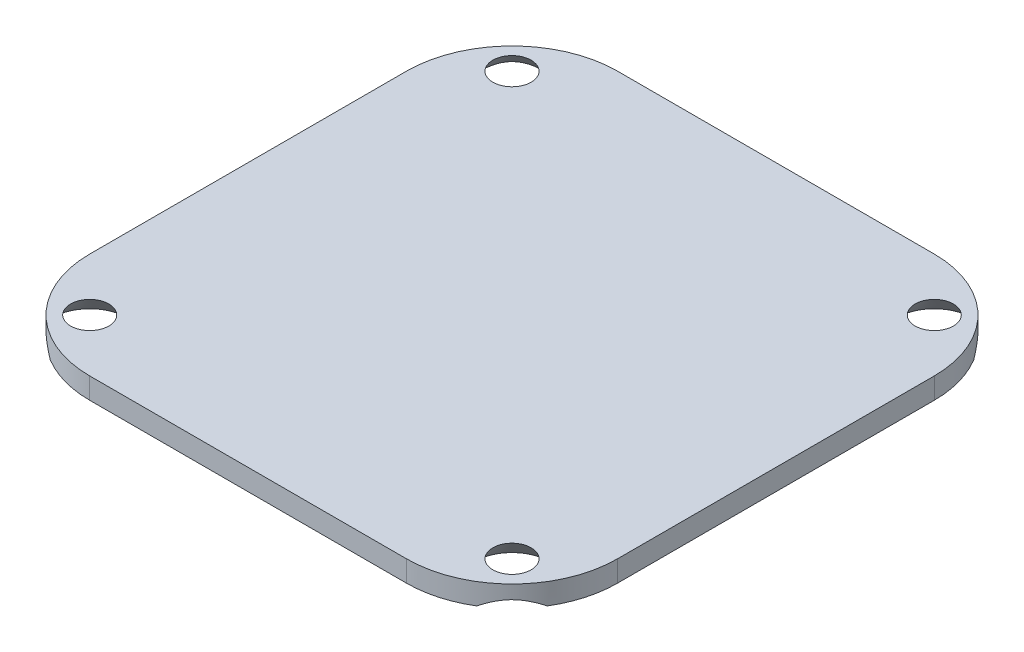
ISO-10303-21;
HEADER;
FILE_DESCRIPTION(('STEP AP214'),'2;1');
FILE_NAME('part.step','',(''),(''),'','','');
FILE_SCHEMA(('AUTOMOTIVE_DESIGN { 1 0 10303 214 1 1 1 1 }'));
ENDSEC;
DATA;
#1=APPLICATION_CONTEXT('core data for automotive mechanical design processes');
#2=APPLICATION_PROTOCOL_DEFINITION('international standard','automotive_design',2000,#1);
#3=PRODUCT_CONTEXT('',#1,'mechanical');
#4=PRODUCT('Part','Part','',(#3));
#5=PRODUCT_RELATED_PRODUCT_CATEGORY('part','',(#4));
#6=PRODUCT_DEFINITION_FORMATION('','',#4);
#7=PRODUCT_DEFINITION_CONTEXT('part definition',#1,'design');
#8=PRODUCT_DEFINITION('design','',#6,#7);
#9=PRODUCT_DEFINITION_SHAPE('','',#8);
#10=(LENGTH_UNIT() NAMED_UNIT(*) SI_UNIT(.MILLI.,.METRE.));
#11=(NAMED_UNIT(*) PLANE_ANGLE_UNIT() SI_UNIT($,.RADIAN.));
#12=(NAMED_UNIT(*) SI_UNIT($,.STERADIAN.) SOLID_ANGLE_UNIT());
#13=UNCERTAINTY_MEASURE_WITH_UNIT(LENGTH_MEASURE(1.E-05),#10,'distance_accuracy_value','');
#14=(GEOMETRIC_REPRESENTATION_CONTEXT(3) GLOBAL_UNCERTAINTY_ASSIGNED_CONTEXT((#13)) GLOBAL_UNIT_ASSIGNED_CONTEXT((#10,
#11,#12)) REPRESENTATION_CONTEXT('',''));
#15=CARTESIAN_POINT('',(0.,0.,0.));
#16=DIRECTION('',(0.,0.,1.));
#17=DIRECTION('',(1.,0.,0.));
#18=AXIS2_PLACEMENT_3D('',#15,#16,#17);
#19=CARTESIAN_POINT('',(25.,2.,-25.));
#20=DIRECTION('',(-1.,0.,0.));
#21=DIRECTION('',(0.,0.,1.));
#22=AXIS2_PLACEMENT_3D('',#19,#20,#21);
#23=PLANE('',#22);
#24=DIRECTION('',(0.,0.,-1.));
#25=VECTOR('',#24,1.);
#26=CARTESIAN_POINT('',(25.,2.,-25.));
#27=LINE('',#26,#25);
#28=CARTESIAN_POINT('',(25.,2.,15.));
#29=VERTEX_POINT('',#28);
#30=CARTESIAN_POINT('',(25.,2.,-15.));
#31=VERTEX_POINT('',#30);
#32=EDGE_CURVE('E296',#29,#31,#27,.T.);
#33=ORIENTED_EDGE('',*,*,#32,.F.);
#34=DIRECTION('',(0.,-1.,0.));
#35=VECTOR('',#34,1.);
#36=CARTESIAN_POINT('',(25.,2.,15.));
#37=LINE('',#36,#35);
#38=CARTESIAN_POINT('',(25.,0.,15.));
#39=VERTEX_POINT('',#38);
#40=EDGE_CURVE('E148',#29,#39,#37,.T.);
#41=ORIENTED_EDGE('',*,*,#40,.T.);
#42=DIRECTION('',(0.,0.,-1.));
#43=VECTOR('',#42,1.);
#44=CARTESIAN_POINT('',(25.,0.,-25.));
#45=LINE('',#44,#43);
#46=CARTESIAN_POINT('',(25.,0.,-15.));
#47=VERTEX_POINT('',#46);
#48=EDGE_CURVE('E295',#39,#47,#45,.T.);
#49=ORIENTED_EDGE('',*,*,#48,.T.);
#50=DIRECTION('',(0.,-1.,0.));
#51=VECTOR('',#50,1.);
#52=CARTESIAN_POINT('',(25.,2.,-15.));
#53=LINE('',#52,#51);
#54=EDGE_CURVE('E154',#47,#31,#53,.F.);
#55=ORIENTED_EDGE('',*,*,#54,.T.);
#56=EDGE_LOOP('',(#33,#41,#49,#55));
#57=FACE_BOUND('',#56,.T.);
#58=ADVANCED_FACE('F38',(#57),#23,.F.);
#59=CARTESIAN_POINT('',(-25.,2.,-25.));
#60=DIRECTION('',(0.,0.,1.));
#61=DIRECTION('',(1.,0.,0.));
#62=AXIS2_PLACEMENT_3D('',#59,#60,#61);
#63=PLANE('',#62);
#64=DIRECTION('',(-1.,0.,0.));
#65=VECTOR('',#64,1.);
#66=CARTESIAN_POINT('',(-25.,2.,-25.));
#67=LINE('',#66,#65);
#68=CARTESIAN_POINT('',(15.,2.,-25.));
#69=VERTEX_POINT('',#68);
#70=CARTESIAN_POINT('',(-15.,2.,-25.));
#71=VERTEX_POINT('',#70);
#72=EDGE_CURVE('E300',#69,#71,#67,.T.);
#73=ORIENTED_EDGE('',*,*,#72,.F.);
#74=DIRECTION('',(0.,-1.,0.));
#75=VECTOR('',#74,1.);
#76=CARTESIAN_POINT('',(15.,2.,-25.));
#77=LINE('',#76,#75);
#78=CARTESIAN_POINT('',(15.,0.,-25.));
#79=VERTEX_POINT('',#78);
#80=EDGE_CURVE('E194',#69,#79,#77,.T.);
#81=ORIENTED_EDGE('',*,*,#80,.T.);
#82=DIRECTION('',(-1.,0.,0.));
#83=VECTOR('',#82,1.);
#84=CARTESIAN_POINT('',(-25.,0.,-25.));
#85=LINE('',#84,#83);
#86=CARTESIAN_POINT('',(-15.,0.,-25.));
#87=VERTEX_POINT('',#86);
#88=EDGE_CURVE('E316',#79,#87,#85,.T.);
#89=ORIENTED_EDGE('',*,*,#88,.T.);
#90=DIRECTION('',(0.,-1.,0.));
#91=VECTOR('',#90,1.);
#92=CARTESIAN_POINT('',(-15.,2.,-25.));
#93=LINE('',#92,#91);
#94=EDGE_CURVE('E191',#87,#71,#93,.F.);
#95=ORIENTED_EDGE('',*,*,#94,.T.);
#96=EDGE_LOOP('',(#73,#81,#89,#95));
#97=FACE_BOUND('',#96,.T.);
#98=ADVANCED_FACE('F243',(#97),#63,.F.);
#99=CARTESIAN_POINT('',(-25.,2.,-25.));
#100=DIRECTION('',(1.,0.,0.));
#101=DIRECTION('',(0.,0.,-1.));
#102=AXIS2_PLACEMENT_3D('',#99,#100,#101);
#103=PLANE('',#102);
#104=DIRECTION('',(0.,0.,1.));
#105=VECTOR('',#104,1.);
#106=CARTESIAN_POINT('',(-25.,2.,-25.));
#107=LINE('',#106,#105);
#108=CARTESIAN_POINT('',(-25.,2.,-15.));
#109=VERTEX_POINT('',#108);
#110=CARTESIAN_POINT('',(-25.,2.,15.));
#111=VERTEX_POINT('',#110);
#112=EDGE_CURVE('E305',#109,#111,#107,.T.);
#113=ORIENTED_EDGE('',*,*,#112,.F.);
#114=DIRECTION('',(0.,-1.,0.));
#115=VECTOR('',#114,1.);
#116=CARTESIAN_POINT('',(-25.,2.,-15.));
#117=LINE('',#116,#115);
#118=CARTESIAN_POINT('',(-25.,0.,-15.));
#119=VERTEX_POINT('',#118);
#120=EDGE_CURVE('E200',#109,#119,#117,.T.);
#121=ORIENTED_EDGE('',*,*,#120,.T.);
#122=DIRECTION('',(0.,0.,1.));
#123=VECTOR('',#122,1.);
#124=CARTESIAN_POINT('',(-25.,0.,-25.));
#125=LINE('',#124,#123);
#126=CARTESIAN_POINT('',(-25.,0.,15.));
#127=VERTEX_POINT('',#126);
#128=EDGE_CURVE('E320',#119,#127,#125,.T.);
#129=ORIENTED_EDGE('',*,*,#128,.T.);
#130=DIRECTION('',(0.,-1.,0.));
#131=VECTOR('',#130,1.);
#132=CARTESIAN_POINT('',(-25.,2.,15.));
#133=LINE('',#132,#131);
#134=EDGE_CURVE('E146',#127,#111,#133,.F.);
#135=ORIENTED_EDGE('',*,*,#134,.T.);
#136=EDGE_LOOP('',(#113,#121,#129,#135));
#137=FACE_BOUND('',#136,.T.);
#138=ADVANCED_FACE('F239',(#137),#103,.F.);
#139=CARTESIAN_POINT('',(-25.,2.,25.));
#140=DIRECTION('',(0.,0.,-1.));
#141=DIRECTION('',(-1.,0.,0.));
#142=AXIS2_PLACEMENT_3D('',#139,#140,#141);
#143=PLANE('',#142);
#144=DIRECTION('',(1.,0.,0.));
#145=VECTOR('',#144,1.);
#146=CARTESIAN_POINT('',(-25.,0.,25.));
#147=LINE('',#146,#145);
#148=CARTESIAN_POINT('',(-15.,0.,25.));
#149=VERTEX_POINT('',#148);
#150=CARTESIAN_POINT('',(15.,0.,25.));
#151=VERTEX_POINT('',#150);
#152=EDGE_CURVE('E301',#149,#151,#147,.T.);
#153=ORIENTED_EDGE('',*,*,#152,.T.);
#154=DIRECTION('',(0.,-1.,0.));
#155=VECTOR('',#154,1.);
#156=CARTESIAN_POINT('',(15.,2.,25.));
#157=LINE('',#156,#155);
#158=CARTESIAN_POINT('',(15.,2.,25.));
#159=VERTEX_POINT('',#158);
#160=EDGE_CURVE('E176',#151,#159,#157,.F.);
#161=ORIENTED_EDGE('',*,*,#160,.T.);
#162=DIRECTION('',(1.,0.,0.));
#163=VECTOR('',#162,1.);
#164=CARTESIAN_POINT('',(-25.,2.,25.));
#165=LINE('',#164,#163);
#166=CARTESIAN_POINT('',(-15.,2.,25.));
#167=VERTEX_POINT('',#166);
#168=EDGE_CURVE('E309',#167,#159,#165,.T.);
#169=ORIENTED_EDGE('',*,*,#168,.F.);
#170=DIRECTION('',(0.,-1.,0.));
#171=VECTOR('',#170,1.);
#172=CARTESIAN_POINT('',(-15.,2.,25.));
#173=LINE('',#172,#171);
#174=EDGE_CURVE('E172',#167,#149,#173,.T.);
#175=ORIENTED_EDGE('',*,*,#174,.T.);
#176=EDGE_LOOP('',(#153,#161,#169,#175));
#177=FACE_BOUND('',#176,.T.);
#178=ADVANCED_FACE('F232',(#177),#143,.F.);
#179=CARTESIAN_POINT('',(0.,2.,0.));
#180=DIRECTION('',(0.,1.,0.));
#181=DIRECTION('',(0.,0.,1.));
#182=AXIS2_PLACEMENT_3D('',#179,#180,#181);
#183=PLANE('',#182);
#184=CARTESIAN_POINT('',(-20.,2.,20.));
#185=DIRECTION('',(0.,1.,0.));
#186=DIRECTION('',(0.,0.,1.));
#187=AXIS2_PLACEMENT_3D('',#184,#185,#186);
#188=CIRCLE('',#187,1.81142652436753);
#189=CARTESIAN_POINT('',(-20.,2.,21.8114265243675));
#190=VERTEX_POINT('',#189);
#191=EDGE_CURVE('E142',#190,#190,#188,.T.);
#192=ORIENTED_EDGE('',*,*,#191,.F.);
#193=EDGE_LOOP('',(#192));
#194=FACE_BOUND('',#193,.T.);
#195=CARTESIAN_POINT('',(20.,2.,20.));
#196=DIRECTION('',(0.,1.,0.));
#197=DIRECTION('',(0.,0.,1.));
#198=AXIS2_PLACEMENT_3D('',#195,#196,#197);
#199=CIRCLE('',#198,1.81142652436753);
#200=CARTESIAN_POINT('',(20.,2.,21.8114265243675));
#201=VERTEX_POINT('',#200);
#202=EDGE_CURVE('E275',#201,#201,#199,.T.);
#203=ORIENTED_EDGE('',*,*,#202,.F.);
#204=EDGE_LOOP('',(#203));
#205=FACE_BOUND('',#204,.T.);
#206=CARTESIAN_POINT('',(20.,2.,-20.));
#207=DIRECTION('',(0.,1.,0.));
#208=DIRECTION('',(0.,0.,1.));
#209=AXIS2_PLACEMENT_3D('',#206,#207,#208);
#210=CIRCLE('',#209,1.81142652436753);
#211=CARTESIAN_POINT('',(20.,2.,-18.1885734756325));
#212=VERTEX_POINT('',#211);
#213=EDGE_CURVE('E284',#212,#212,#210,.T.);
#214=ORIENTED_EDGE('',*,*,#213,.F.);
#215=EDGE_LOOP('',(#214));
#216=FACE_BOUND('',#215,.T.);
#217=CARTESIAN_POINT('',(-20.,2.,-20.));
#218=DIRECTION('',(0.,1.,0.));
#219=DIRECTION('',(0.,0.,1.));
#220=AXIS2_PLACEMENT_3D('',#217,#218,#219);
#221=CIRCLE('',#220,1.81142652436753);
#222=CARTESIAN_POINT('',(-20.,2.,-18.1885734756325));
#223=VERTEX_POINT('',#222);
#224=EDGE_CURVE('E291',#223,#223,#221,.T.);
#225=ORIENTED_EDGE('',*,*,#224,.F.);
#226=EDGE_LOOP('',(#225));
#227=FACE_BOUND('',#226,.T.);
#228=ORIENTED_EDGE('',*,*,#168,.T.);
#229=CARTESIAN_POINT('',(15.,2.,15.));
#230=DIRECTION('',(0.,1.,0.));
#231=DIRECTION('',(0.,0.,1.));
#232=AXIS2_PLACEMENT_3D('',#229,#230,#231);
#233=CIRCLE('',#232,10.);
#234=EDGE_CURVE('E188',#159,#29,#233,.T.);
#235=ORIENTED_EDGE('',*,*,#234,.T.);
#236=ORIENTED_EDGE('',*,*,#32,.T.);
#237=CARTESIAN_POINT('',(15.,2.,-15.));
#238=DIRECTION('',(0.,1.,0.));
#239=DIRECTION('',(0.,0.,1.));
#240=AXIS2_PLACEMENT_3D('',#237,#238,#239);
#241=CIRCLE('',#240,10.);
#242=EDGE_CURVE('E185',#31,#69,#241,.T.);
#243=ORIENTED_EDGE('',*,*,#242,.T.);
#244=ORIENTED_EDGE('',*,*,#72,.T.);
#245=CARTESIAN_POINT('',(-15.,2.,-15.));
#246=DIRECTION('',(0.,1.,0.));
#247=DIRECTION('',(0.,0.,1.));
#248=AXIS2_PLACEMENT_3D('',#245,#246,#247);
#249=CIRCLE('',#248,10.);
#250=EDGE_CURVE('E182',#71,#109,#249,.T.);
#251=ORIENTED_EDGE('',*,*,#250,.T.);
#252=ORIENTED_EDGE('',*,*,#112,.T.);
#253=CARTESIAN_POINT('',(-15.,2.,15.));
#254=DIRECTION('',(0.,1.,0.));
#255=DIRECTION('',(0.,0.,1.));
#256=AXIS2_PLACEMENT_3D('',#253,#254,#255);
#257=CIRCLE('',#256,10.);
#258=EDGE_CURVE('E179',#111,#167,#257,.T.);
#259=ORIENTED_EDGE('',*,*,#258,.T.);
#260=EDGE_LOOP('',(#228,#235,#236,#243,#244,#251,#252,#259));
#261=FACE_BOUND('',#260,.T.);
#262=ADVANCED_FACE('F229',(#194,#205,#216,#227,#261),#183,.T.);
#263=CARTESIAN_POINT('',(0.,0.,0.));
#264=DIRECTION('',(0.,1.,0.));
#265=DIRECTION('',(0.,0.,1.));
#266=AXIS2_PLACEMENT_3D('',#263,#264,#265);
#267=PLANE('',#266);
#268=CARTESIAN_POINT('',(-15.,0.,15.));
#269=DIRECTION('',(0.,1.,0.));
#270=DIRECTION('',(0.,0.,1.));
#271=AXIS2_PLACEMENT_3D('',#268,#269,#270);
#272=CIRCLE('',#271,10.);
#273=CARTESIAN_POINT('',(-20.1951160667875,0.,23.5446339332125));
#274=VERTEX_POINT('',#273);
#275=EDGE_CURVE('E140',#149,#274,#272,.F.);
#276=ORIENTED_EDGE('',*,*,#275,.T.);
#277=CARTESIAN_POINT('',(-20.,0.,20.));
#278=DIRECTION('',(0.,-1.,0.));
#279=DIRECTION('',(0.,0.,-1.));
#280=AXIS2_PLACEMENT_3D('',#277,#278,#279);
#281=CIRCLE('',#280,3.55);
#282=CARTESIAN_POINT('',(-23.5446339332125,0.,20.1951160667875));
#283=VERTEX_POINT('',#282);
#284=EDGE_CURVE('E58',#283,#274,#281,.T.);
#285=ORIENTED_EDGE('',*,*,#284,.F.);
#286=EDGE_CURVE('E137',#283,#127,#272,.F.);
#287=ORIENTED_EDGE('',*,*,#286,.T.);
#288=ORIENTED_EDGE('',*,*,#128,.F.);
#289=CARTESIAN_POINT('',(-15.,0.,-15.));
#290=DIRECTION('',(0.,1.,0.));
#291=DIRECTION('',(0.,0.,1.));
#292=AXIS2_PLACEMENT_3D('',#289,#290,#291);
#293=CIRCLE('',#292,10.);
#294=CARTESIAN_POINT('',(-23.5446339332125,0.,-20.1951160667875));
#295=VERTEX_POINT('',#294);
#296=EDGE_CURVE('E158',#119,#295,#293,.F.);
#297=ORIENTED_EDGE('',*,*,#296,.T.);
#298=CARTESIAN_POINT('',(-20.,0.,-20.));
#299=DIRECTION('',(0.,-1.,0.));
#300=DIRECTION('',(0.,0.,-1.));
#301=AXIS2_PLACEMENT_3D('',#298,#299,#300);
#302=CIRCLE('',#301,3.55);
#303=CARTESIAN_POINT('',(-20.1951160667875,0.,-23.5446339332125));
#304=VERTEX_POINT('',#303);
#305=EDGE_CURVE('E288',#304,#295,#302,.T.);
#306=ORIENTED_EDGE('',*,*,#305,.F.);
#307=EDGE_CURVE('E152',#304,#87,#293,.F.);
#308=ORIENTED_EDGE('',*,*,#307,.T.);
#309=ORIENTED_EDGE('',*,*,#88,.F.);
#310=CARTESIAN_POINT('',(15.,0.,-15.));
#311=DIRECTION('',(0.,1.,0.));
#312=DIRECTION('',(0.,0.,1.));
#313=AXIS2_PLACEMENT_3D('',#310,#311,#312);
#314=CIRCLE('',#313,10.);
#315=CARTESIAN_POINT('',(20.1951160667875,0.,-23.5446339332125));
#316=VERTEX_POINT('',#315);
#317=EDGE_CURVE('E163',#79,#316,#314,.F.);
#318=ORIENTED_EDGE('',*,*,#317,.T.);
#319=CARTESIAN_POINT('',(20.,0.,-20.));
#320=DIRECTION('',(0.,-1.,0.));
#321=DIRECTION('',(0.,0.,-1.));
#322=AXIS2_PLACEMENT_3D('',#319,#320,#321);
#323=CIRCLE('',#322,3.55);
#324=CARTESIAN_POINT('',(23.5446339332125,0.,-20.1951160667875));
#325=VERTEX_POINT('',#324);
#326=EDGE_CURVE('E281',#325,#316,#323,.T.);
#327=ORIENTED_EDGE('',*,*,#326,.F.);
#328=EDGE_CURVE('E162',#325,#47,#314,.F.);
#329=ORIENTED_EDGE('',*,*,#328,.T.);
#330=ORIENTED_EDGE('',*,*,#48,.F.);
#331=CARTESIAN_POINT('',(15.,0.,15.));
#332=DIRECTION('',(0.,1.,0.));
#333=DIRECTION('',(0.,0.,1.));
#334=AXIS2_PLACEMENT_3D('',#331,#332,#333);
#335=CIRCLE('',#334,10.);
#336=CARTESIAN_POINT('',(23.5446339332125,0.,20.1951160667875));
#337=VERTEX_POINT('',#336);
#338=EDGE_CURVE('E168',#39,#337,#335,.F.);
#339=ORIENTED_EDGE('',*,*,#338,.T.);
#340=CARTESIAN_POINT('',(20.,0.,20.));
#341=DIRECTION('',(0.,-1.,0.));
#342=DIRECTION('',(0.,0.,-1.));
#343=AXIS2_PLACEMENT_3D('',#340,#341,#342);
#344=CIRCLE('',#343,3.55);
#345=CARTESIAN_POINT('',(20.1951160667875,0.,23.5446339332125));
#346=VERTEX_POINT('',#345);
#347=EDGE_CURVE('E65',#346,#337,#344,.T.);
#348=ORIENTED_EDGE('',*,*,#347,.F.);
#349=EDGE_CURVE('E167',#346,#151,#335,.F.);
#350=ORIENTED_EDGE('',*,*,#349,.T.);
#351=ORIENTED_EDGE('',*,*,#152,.F.);
#352=EDGE_LOOP('',(#276,#285,#287,#288,#297,#306,#308,#309,#318,#327,#329,#330,#339,#348,#350,#351));
#353=FACE_BOUND('',#352,.T.);
#354=ADVANCED_FACE('F135',(#353),#267,.F.);
#355=CARTESIAN_POINT('',(15.,2.,15.));
#356=DIRECTION('',(0.,-1.,0.));
#357=DIRECTION('',(0.,0.,-1.));
#358=AXIS2_PLACEMENT_3D('',#355,#356,#357);
#359=CYLINDRICAL_SURFACE('',#358,10.);
#360=CARTESIAN_POINT('',(23.5448253715897,-0.000200000000008381,20.1948011866709));
#361=CARTESIAN_POINT('',(23.481930670142,0.0654458212702774,20.298237587988));
#362=CARTESIAN_POINT('',(23.4164293713767,0.128675498115289,20.4017643818466));
#363=CARTESIAN_POINT('',(23.2795795083504,0.248749121934523,20.6092886137423));
#364=CARTESIAN_POINT('',(23.2082109211866,0.30556948763689,20.7132864133895));
#365=CARTESIAN_POINT('',(23.0585229004713,0.411422686616633,20.9225793826056));
#366=CARTESIAN_POINT('',(22.980128939771,0.460351438867966,21.0278748173493));
#367=CARTESIAN_POINT('',(22.8169974103255,0.547138142495655,21.2379638891275));
#368=CARTESIAN_POINT('',(22.7322689085601,0.5850115508596,21.342758023315));
#369=CARTESIAN_POINT('',(22.5812168523255,0.638549891863076,21.5218683493506));
#370=CARTESIAN_POINT('',(22.516400307114,0.657464515793342,21.5964853257232));
#371=CARTESIAN_POINT('',(22.383754704677,0.687528017290395,21.7446308428981));
#372=CARTESIAN_POINT('',(22.315925594771,0.698676758998727,21.8181593646368));
#373=CARTESIAN_POINT('',(22.1781548820673,0.712615042343455,21.9630463749211));
#374=CARTESIAN_POINT('',(22.108231416405,0.71546262188684,22.0344164605011));
#375=CARTESIAN_POINT('',(21.9663558443186,0.712820395621954,22.1749464189617));
#376=CARTESIAN_POINT('',(21.8944037771458,0.707330751021627,22.2441063345514));
#377=CARTESIAN_POINT('',(21.7492372748898,0.688313815790641,22.3795409161204));
#378=CARTESIAN_POINT('',(21.6760266980398,0.674807901131329,22.4458227540922));
#379=CARTESIAN_POINT('',(21.5286865986548,0.640402493838656,22.5753471988243));
#380=CARTESIAN_POINT('',(21.4545569930564,0.619502328130127,22.6385895283124));
#381=CARTESIAN_POINT('',(21.2305327994268,0.546652481181534,22.824204481674));
#382=CARTESIAN_POINT('',(21.079817140961,0.484675432943549,22.9417091933051));
#383=CARTESIAN_POINT('',(20.8059358591875,0.354511549796639,23.143377255855));
#384=CARTESIAN_POINT('',(20.682763917985,0.289524103052688,23.2297111411257));
#385=CARTESIAN_POINT('',(20.4988190383992,0.185217635838285,23.3527443665902));
#386=CARTESIAN_POINT('',(20.4379782090457,0.14952990197315,23.392472657333));
#387=CARTESIAN_POINT('',(20.3163535311014,0.0761183675580976,23.4700404657244));
#388=CARTESIAN_POINT('',(20.2555696704603,0.0383952275613291,23.5078805885602));
#389=CARTESIAN_POINT('',(20.194801186671,-0.000200000000001004,23.5448253715896));
#390=B_SPLINE_CURVE_WITH_KNOTS('',3,(#360,#361,#362,#363,#364,#365,#366,#367,#368,#369,#370,
#371,#372,#373,#374,#375,#376,#377,#378,#379,#380,#381,#382,#383,#384,#385,#386,#387,#388,#389),
.UNSPECIFIED.,.F.,.F.,(4,2,2,2,2,2,2,2,2,2,2,2,2,2,4),(0.,0.413247494065393,0.827968973718824,
1.24777789043507,1.66699701022159,1.96858002804459,2.27016832171045,2.56964293127841,
2.8691117503014,3.16778557893444,3.46648660189476,4.06720619102881,4.55825530982291,
4.80107397726772,5.04381431094027),.UNSPECIFIED.);
#391=EDGE_CURVE('E53',#337,#346,#390,.T.);
#392=ORIENTED_EDGE('',*,*,#391,.F.);
#393=ORIENTED_EDGE('',*,*,#338,.F.);
#394=ORIENTED_EDGE('',*,*,#40,.F.);
#395=ORIENTED_EDGE('',*,*,#234,.F.);
#396=ORIENTED_EDGE('',*,*,#160,.F.);
#397=ORIENTED_EDGE('',*,*,#349,.F.);
#398=EDGE_LOOP('',(#392,#393,#394,#395,#396,#397));
#399=FACE_BOUND('',#398,.T.);
#400=ADVANCED_FACE('F236',(#399),#359,.T.);
#401=CARTESIAN_POINT('',(15.,2.,-15.));
#402=DIRECTION('',(0.,-1.,0.));
#403=DIRECTION('',(0.,0.,-1.));
#404=AXIS2_PLACEMENT_3D('',#401,#402,#403);
#405=CYLINDRICAL_SURFACE('',#404,10.);
#406=CARTESIAN_POINT('',(20.1948011866709,-0.000200000000007996,-23.5448253715897));
#407=CARTESIAN_POINT('',(20.298237587988,0.0654458212702778,-23.481930670142));
#408=CARTESIAN_POINT('',(20.4017643818466,0.128675498115289,-23.4164293713767));
#409=CARTESIAN_POINT('',(20.6092886137423,0.248749121934523,-23.2795795083504));
#410=CARTESIAN_POINT('',(20.7132864133895,0.305569487636891,-23.2082109211867));
#411=CARTESIAN_POINT('',(20.9225793826056,0.411422686616636,-23.0585229004713));
#412=CARTESIAN_POINT('',(21.0278748173493,0.46035143886797,-22.980128939771));
#413=CARTESIAN_POINT('',(21.2379638891275,0.54713814249566,-22.8169974103255));
#414=CARTESIAN_POINT('',(21.342758023315,0.585011550859603,-22.7322689085601));
#415=CARTESIAN_POINT('',(21.5218683493506,0.638549891863079,-22.5812168523255));
#416=CARTESIAN_POINT('',(21.5964853257232,0.657464515793346,-22.516400307114));
#417=CARTESIAN_POINT('',(21.7446308428981,0.6875280172904,-22.383754704677));
#418=CARTESIAN_POINT('',(21.8181593646368,0.698676758998732,-22.315925594771));
#419=CARTESIAN_POINT('',(21.9630463749211,0.712615042343462,-22.1781548820674));
#420=CARTESIAN_POINT('',(22.0344164605011,0.715462621886847,-22.108231416405));
#421=CARTESIAN_POINT('',(22.1749464189617,0.712820395621961,-21.9663558443186));
#422=CARTESIAN_POINT('',(22.2441063345514,0.707330751021634,-21.8944037771458));
#423=CARTESIAN_POINT('',(22.3795409161204,0.688313815790648,-21.7492372748898));
#424=CARTESIAN_POINT('',(22.4458227540922,0.674807901131336,-21.6760266980398));
#425=CARTESIAN_POINT('',(22.5753471988243,0.640402493838664,-21.5286865986548));
#426=CARTESIAN_POINT('',(22.6385895283124,0.619502328130136,-21.4545569930564));
#427=CARTESIAN_POINT('',(22.824204481674,0.546652481181543,-21.2305327994268));
#428=CARTESIAN_POINT('',(22.9417091933051,0.484675432943558,-21.079817140961));
#429=CARTESIAN_POINT('',(23.143377255855,0.354511549796648,-20.8059358591875));
#430=CARTESIAN_POINT('',(23.2297111411257,0.289524103052696,-20.682763917985));
#431=CARTESIAN_POINT('',(23.3527443665902,0.185217635838288,-20.4988190383992));
#432=CARTESIAN_POINT('',(23.392472657333,0.14952990197315,-20.4379782090457));
#433=CARTESIAN_POINT('',(23.4700404657244,0.0761183675580936,-20.3163535311014));
#434=CARTESIAN_POINT('',(23.5078805885602,0.0383952275613235,-20.2555696704603));
#435=CARTESIAN_POINT('',(23.5448253715897,-0.000200000000007453,-20.1948011866709));
#436=B_SPLINE_CURVE_WITH_KNOTS('',3,(#406,#407,#408,#409,#410,#411,#412,#413,#414,#415,#416,
#417,#418,#419,#420,#421,#422,#423,#424,#425,#426,#427,#428,#429,#430,#431,#432,#433,#434,#435),
.UNSPECIFIED.,.F.,.F.,(4,2,2,2,2,2,2,2,2,2,2,2,2,2,4),(0.,0.41324749406539,0.827968973718824,
1.24777789043508,1.66699701022159,1.96858002804459,2.27016832171045,2.56964293127841,
2.8691117503014,3.16778557893444,3.46648660189475,4.0672061910288,4.55825530982292,
4.80107397726774,5.0438143109403),.UNSPECIFIED.);
#437=EDGE_CURVE('E212',#316,#325,#436,.T.);
#438=ORIENTED_EDGE('',*,*,#437,.F.);
#439=ORIENTED_EDGE('',*,*,#317,.F.);
#440=ORIENTED_EDGE('',*,*,#80,.F.);
#441=ORIENTED_EDGE('',*,*,#242,.F.);
#442=ORIENTED_EDGE('',*,*,#54,.F.);
#443=ORIENTED_EDGE('',*,*,#328,.F.);
#444=EDGE_LOOP('',(#438,#439,#440,#441,#442,#443));
#445=FACE_BOUND('',#444,.T.);
#446=ADVANCED_FACE('F253',(#445),#405,.T.);
#447=CARTESIAN_POINT('',(-15.,2.,-15.));
#448=DIRECTION('',(0.,-1.,0.));
#449=DIRECTION('',(0.,0.,-1.));
#450=AXIS2_PLACEMENT_3D('',#447,#448,#449);
#451=CYLINDRICAL_SURFACE('',#450,10.);
#452=CARTESIAN_POINT('',(-23.5448253715897,-0.000200000000009355,-20.1948011866709));
#453=CARTESIAN_POINT('',(-23.481930670142,0.0654458212702759,-20.298237587988));
#454=CARTESIAN_POINT('',(-23.4164293713767,0.128675498115287,-20.4017643818466));
#455=CARTESIAN_POINT('',(-23.2795795083504,0.248749121934522,-20.6092886137423));
#456=CARTESIAN_POINT('',(-23.2082109211867,0.30556948763689,-20.7132864133895));
#457=CARTESIAN_POINT('',(-23.0585229004713,0.411422686616634,-20.9225793826056));
#458=CARTESIAN_POINT('',(-22.9801289397711,0.460351438867967,-21.0278748173493));
#459=CARTESIAN_POINT('',(-22.8169974103255,0.547138142495657,-21.2379638891275));
#460=CARTESIAN_POINT('',(-22.7322689085602,0.5850115508596,-21.342758023315));
#461=CARTESIAN_POINT('',(-22.5812168523255,0.638549891863077,-21.5218683493507));
#462=CARTESIAN_POINT('',(-22.516400307114,0.657464515793344,-21.5964853257232));
#463=CARTESIAN_POINT('',(-22.383754704677,0.687528017290398,-21.7446308428981));
#464=CARTESIAN_POINT('',(-22.315925594771,0.698676758998729,-21.8181593646368));
#465=CARTESIAN_POINT('',(-22.1781548820674,0.712615042343458,-21.9630463749211));
#466=CARTESIAN_POINT('',(-22.108231416405,0.715462621886844,-22.0344164605011));
#467=CARTESIAN_POINT('',(-21.9663558443186,0.712820395621958,-22.1749464189617));
#468=CARTESIAN_POINT('',(-21.8944037771458,0.707330751021631,-22.2441063345514));
#469=CARTESIAN_POINT('',(-21.7492372748898,0.688313815790645,-22.3795409161204));
#470=CARTESIAN_POINT('',(-21.6760266980398,0.674807901131331,-22.4458227540922));
#471=CARTESIAN_POINT('',(-21.5286865986548,0.640402493838659,-22.5753471988243));
#472=CARTESIAN_POINT('',(-21.4545569930564,0.619502328130132,-22.6385895283124));
#473=CARTESIAN_POINT('',(-21.2305327994268,0.546652481181541,-22.824204481674));
#474=CARTESIAN_POINT('',(-21.079817140961,0.484675432943554,-22.9417091933051));
#475=CARTESIAN_POINT('',(-20.8059358591875,0.354511549796642,-23.143377255855));
#476=CARTESIAN_POINT('',(-20.682763917985,0.289524103052692,-23.2297111411257));
#477=CARTESIAN_POINT('',(-20.4988190383992,0.185217635838288,-23.3527443665902));
#478=CARTESIAN_POINT('',(-20.4379782090457,0.149529901973153,-23.392472657333));
#479=CARTESIAN_POINT('',(-20.3163535311014,0.0761183675581007,-23.4700404657244));
#480=CARTESIAN_POINT('',(-20.2555696704603,0.038395227561332,-23.5078805885602));
#481=CARTESIAN_POINT('',(-20.194801186671,-0.000199999999998415,-23.5448253715896));
#482=B_SPLINE_CURVE_WITH_KNOTS('',3,(#452,#453,#454,#455,#456,#457,#458,#459,#460,#461,#462,
#463,#464,#465,#466,#467,#468,#469,#470,#471,#472,#473,#474,#475,#476,#477,#478,#479,#480,#481),
.UNSPECIFIED.,.F.,.F.,(4,2,2,2,2,2,2,2,2,2,2,2,2,2,4),(0.,0.413247494065388,0.827968973718822,
1.24777789043507,1.66699701022159,1.96858002804459,2.27016832171044,2.56964293127841,
2.8691117503014,3.16778557893444,3.46648660189475,4.0672061910288,4.55825530982291,
4.80107397726772,5.04381431094027),.UNSPECIFIED.);
#483=EDGE_CURVE('E204',#295,#304,#482,.T.);
#484=ORIENTED_EDGE('',*,*,#483,.F.);
#485=ORIENTED_EDGE('',*,*,#296,.F.);
#486=ORIENTED_EDGE('',*,*,#120,.F.);
#487=ORIENTED_EDGE('',*,*,#250,.F.);
#488=ORIENTED_EDGE('',*,*,#94,.F.);
#489=ORIENTED_EDGE('',*,*,#307,.F.);
#490=EDGE_LOOP('',(#484,#485,#486,#487,#488,#489));
#491=FACE_BOUND('',#490,.T.);
#492=ADVANCED_FACE('F219',(#491),#451,.T.);
#493=CARTESIAN_POINT('',(-15.,2.,15.));
#494=DIRECTION('',(0.,-1.,0.));
#495=DIRECTION('',(0.,0.,-1.));
#496=AXIS2_PLACEMENT_3D('',#493,#494,#495);
#497=CYLINDRICAL_SURFACE('',#496,10.);
#498=CARTESIAN_POINT('',(-20.194801186671,-0.000200000000000218,23.5448253715896));
#499=CARTESIAN_POINT('',(-20.2982375879881,0.0654458212702849,23.481930670142));
#500=CARTESIAN_POINT('',(-20.4017643818466,0.128675498115295,23.4164293713767));
#501=CARTESIAN_POINT('',(-20.6092886137423,0.248749121934529,23.2795795083504));
#502=CARTESIAN_POINT('',(-20.7132864133895,0.305569487636897,23.2082109211866));
#503=CARTESIAN_POINT('',(-20.9225793826057,0.411422686616641,23.0585229004712));
#504=CARTESIAN_POINT('',(-21.0278748173493,0.460351438867975,22.980128939771));
#505=CARTESIAN_POINT('',(-21.2379638891275,0.547138142495665,22.8169974103255));
#506=CARTESIAN_POINT('',(-21.342758023315,0.585011550859608,22.7322689085601));
#507=CARTESIAN_POINT('',(-21.5218683493507,0.638549891863084,22.5812168523255));
#508=CARTESIAN_POINT('',(-21.5964853257232,0.65746451579335,22.516400307114));
#509=CARTESIAN_POINT('',(-21.7446308428981,0.687528017290402,22.383754704677));
#510=CARTESIAN_POINT('',(-21.8181593646368,0.698676758998732,22.3159255947709));
#511=CARTESIAN_POINT('',(-21.9630463749211,0.71261504234346,22.1781548820673));
#512=CARTESIAN_POINT('',(-22.0344164605012,0.715462621886845,22.108231416405));
#513=CARTESIAN_POINT('',(-22.1749464189617,0.71282039562196,21.9663558443186));
#514=CARTESIAN_POINT('',(-22.2441063345514,0.707330751021633,21.8944037771458));
#515=CARTESIAN_POINT('',(-22.3795409161204,0.688313815790647,21.7492372748897));
#516=CARTESIAN_POINT('',(-22.4458227540922,0.674807901131335,21.6760266980398));
#517=CARTESIAN_POINT('',(-22.5753471988243,0.640402493838663,21.5286865986547));
#518=CARTESIAN_POINT('',(-22.6385895283124,0.619502328130133,21.4545569930564));
#519=CARTESIAN_POINT('',(-22.824204481674,0.546652481181538,21.2305327994268));
#520=CARTESIAN_POINT('',(-22.9417091933052,0.484675432943552,21.079817140961));
#521=CARTESIAN_POINT('',(-23.143377255855,0.354511549796642,20.8059358591874));
#522=CARTESIAN_POINT('',(-23.2297111411257,0.289524103052692,20.682763917985));
#523=CARTESIAN_POINT('',(-23.3527443665902,0.185217635838287,20.4988190383991));
#524=CARTESIAN_POINT('',(-23.392472657333,0.149529901973152,20.4379782090457));
#525=CARTESIAN_POINT('',(-23.4700404657244,0.0761183675580983,20.3163535311014));
#526=CARTESIAN_POINT('',(-23.5078805885602,0.0383952275613296,20.2555696704603));
#527=CARTESIAN_POINT('',(-23.5448253715897,-0.000200000000000009,20.1948011866709));
#528=B_SPLINE_CURVE_WITH_KNOTS('',3,(#498,#499,#500,#501,#502,#503,#504,#505,#506,#507,#508,
#509,#510,#511,#512,#513,#514,#515,#516,#517,#518,#519,#520,#521,#522,#523,#524,#525,#526,#527),
.UNSPECIFIED.,.F.,.F.,(4,2,2,2,2,2,2,2,2,2,2,2,2,2,4),(0.,0.413247494065389,0.827968973718823,
1.24777789043508,1.66699701022159,1.96858002804459,2.27016832171045,2.56964293127841,
2.8691117503014,3.16778557893444,3.46648660189475,4.0672061910288,4.5582553098229,
4.80107397726772,5.04381431094026),.UNSPECIFIED.);
#529=EDGE_CURVE('E11',#274,#283,#528,.T.);
#530=ORIENTED_EDGE('',*,*,#529,.F.);
#531=ORIENTED_EDGE('',*,*,#275,.F.);
#532=ORIENTED_EDGE('',*,*,#174,.F.);
#533=ORIENTED_EDGE('',*,*,#258,.F.);
#534=ORIENTED_EDGE('',*,*,#134,.F.);
#535=ORIENTED_EDGE('',*,*,#286,.F.);
#536=EDGE_LOOP('',(#530,#531,#532,#533,#534,#535));
#537=FACE_BOUND('',#536,.T.);
#538=ADVANCED_FACE('F40',(#537),#497,.T.);
#539=CARTESIAN_POINT('',(-20.,0.,-20.));
#540=DIRECTION('',(0.,-1.,0.));
#541=DIRECTION('',(0.,0.,-1.));
#542=AXIS2_PLACEMENT_3D('',#539,#540,#541);
#543=CONICAL_SURFACE('',#542,3.55,0.715584993317679);
#544=ORIENTED_EDGE('',*,*,#224,.T.);
#545=EDGE_LOOP('',(#544));
#546=FACE_BOUND('',#545,.T.);
#547=ORIENTED_EDGE('',*,*,#483,.T.);
#548=ORIENTED_EDGE('',*,*,#305,.T.);
#549=EDGE_LOOP('',(#547,#548));
#550=FACE_BOUND('',#549,.T.);
#551=ADVANCED_FACE('F221',(#546,#550),#543,.F.);
#552=CARTESIAN_POINT('',(20.,0.,-20.));
#553=DIRECTION('',(0.,-1.,0.));
#554=DIRECTION('',(0.,0.,-1.));
#555=AXIS2_PLACEMENT_3D('',#552,#553,#554);
#556=CONICAL_SURFACE('',#555,3.55,0.715584993317679);
#557=ORIENTED_EDGE('',*,*,#213,.T.);
#558=EDGE_LOOP('',(#557));
#559=FACE_BOUND('',#558,.T.);
#560=ORIENTED_EDGE('',*,*,#437,.T.);
#561=ORIENTED_EDGE('',*,*,#326,.T.);
#562=EDGE_LOOP('',(#560,#561));
#563=FACE_BOUND('',#562,.T.);
#564=ADVANCED_FACE('F225',(#559,#563),#556,.F.);
#565=CARTESIAN_POINT('',(20.,0.,20.));
#566=DIRECTION('',(0.,-1.,0.));
#567=DIRECTION('',(0.,0.,-1.));
#568=AXIS2_PLACEMENT_3D('',#565,#566,#567);
#569=CONICAL_SURFACE('',#568,3.55,0.715584993317679);
#570=ORIENTED_EDGE('',*,*,#202,.T.);
#571=EDGE_LOOP('',(#570));
#572=FACE_BOUND('',#571,.T.);
#573=ORIENTED_EDGE('',*,*,#391,.T.);
#574=ORIENTED_EDGE('',*,*,#347,.T.);
#575=EDGE_LOOP('',(#573,#574));
#576=FACE_BOUND('',#575,.T.);
#577=ADVANCED_FACE('F261',(#572,#576),#569,.F.);
#578=CARTESIAN_POINT('',(-20.,0.,20.));
#579=DIRECTION('',(0.,-1.,0.));
#580=DIRECTION('',(0.,0.,-1.));
#581=AXIS2_PLACEMENT_3D('',#578,#579,#580);
#582=CONICAL_SURFACE('',#581,3.55,0.715584993317679);
#583=ORIENTED_EDGE('',*,*,#191,.T.);
#584=EDGE_LOOP('',(#583));
#585=FACE_BOUND('',#584,.T.);
#586=ORIENTED_EDGE('',*,*,#529,.T.);
#587=ORIENTED_EDGE('',*,*,#284,.T.);
#588=EDGE_LOOP('',(#586,#587));
#589=FACE_BOUND('',#588,.T.);
#590=ADVANCED_FACE('F130',(#585,#589),#582,.F.);
#591=CLOSED_SHELL('',(#58,#98,#138,#178,#262,#354,#400,#446,#492,#538,#551,#564,#577,#590));
#592=MANIFOLD_SOLID_BREP('B2',#591);
#593=ADVANCED_BREP_SHAPE_REPRESENTATION('',(#18,#592),#14);
#594=SHAPE_DEFINITION_REPRESENTATION(#9,#593);
ENDSEC;
END-ISO-10303-21;
